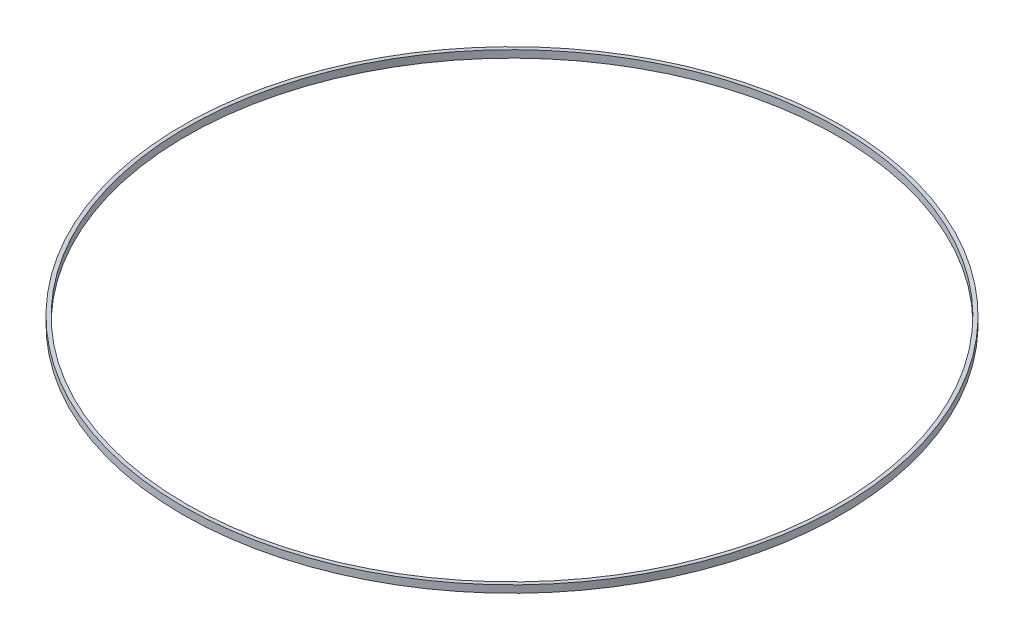
ISO-10303-21;
HEADER;
FILE_DESCRIPTION(('STEP AP214'),'2;1');
FILE_NAME('part.step','',(''),(''),'','','');
FILE_SCHEMA(('AUTOMOTIVE_DESIGN { 1 0 10303 214 1 1 1 1 }'));
ENDSEC;
DATA;
#1=APPLICATION_CONTEXT('core data for automotive mechanical design processes');
#2=APPLICATION_PROTOCOL_DEFINITION('international standard','automotive_design',2000,#1);
#3=PRODUCT_CONTEXT('',#1,'mechanical');
#4=PRODUCT('Part','Part','',(#3));
#5=PRODUCT_RELATED_PRODUCT_CATEGORY('part','',(#4));
#6=PRODUCT_DEFINITION_FORMATION('','',#4);
#7=PRODUCT_DEFINITION_CONTEXT('part definition',#1,'design');
#8=PRODUCT_DEFINITION('design','',#6,#7);
#9=PRODUCT_DEFINITION_SHAPE('','',#8);
#10=(LENGTH_UNIT() NAMED_UNIT(*) SI_UNIT(.MILLI.,.METRE.));
#11=(NAMED_UNIT(*) PLANE_ANGLE_UNIT() SI_UNIT($,.RADIAN.));
#12=(NAMED_UNIT(*) SI_UNIT($,.STERADIAN.) SOLID_ANGLE_UNIT());
#13=UNCERTAINTY_MEASURE_WITH_UNIT(LENGTH_MEASURE(1.E-05),#10,'distance_accuracy_value','');
#14=(GEOMETRIC_REPRESENTATION_CONTEXT(3) GLOBAL_UNCERTAINTY_ASSIGNED_CONTEXT((#13)) GLOBAL_UNIT_ASSIGNED_CONTEXT((#10,
#11,#12)) REPRESENTATION_CONTEXT('',''));
#15=CARTESIAN_POINT('',(0.,0.,0.));
#16=DIRECTION('',(0.,0.,1.));
#17=DIRECTION('',(1.,0.,0.));
#18=AXIS2_PLACEMENT_3D('',#15,#16,#17);
#19=CARTESIAN_POINT('',(0.,1.,0.));
#20=DIRECTION('',(0.,1.,0.));
#21=DIRECTION('',(0.,0.,1.));
#22=AXIS2_PLACEMENT_3D('',#19,#20,#21);
#23=PLANE('',#22);
#24=CARTESIAN_POINT('',(0.,1.,0.));
#25=DIRECTION('',(0.,1.,0.));
#26=DIRECTION('',(0.,0.,1.));
#27=AXIS2_PLACEMENT_3D('',#24,#25,#26);
#28=CIRCLE('',#27,45.);
#29=CARTESIAN_POINT('',(0.,1.,45.));
#30=VERTEX_POINT('',#29);
#31=EDGE_CURVE('E10',#30,#30,#28,.T.);
#32=ORIENTED_EDGE('',*,*,#31,.T.);
#33=EDGE_LOOP('',(#32));
#34=FACE_BOUND('',#33,.T.);
#35=CARTESIAN_POINT('',(0.,1.,0.));
#36=DIRECTION('',(0.,1.,0.));
#37=DIRECTION('',(0.,0.,1.));
#38=AXIS2_PLACEMENT_3D('',#35,#36,#37);
#39=CIRCLE('',#38,44.5);
#40=CARTESIAN_POINT('',(0.,1.,44.5));
#41=VERTEX_POINT('',#40);
#42=EDGE_CURVE('E46',#41,#41,#39,.T.);
#43=ORIENTED_EDGE('',*,*,#42,.F.);
#44=EDGE_LOOP('',(#43));
#45=FACE_BOUND('',#44,.T.);
#46=ADVANCED_FACE('F35',(#34,#45),#23,.T.);
#47=CARTESIAN_POINT('',(0.,0.,0.));
#48=DIRECTION('',(0.,1.,0.));
#49=DIRECTION('',(0.,0.,1.));
#50=AXIS2_PLACEMENT_3D('',#47,#48,#49);
#51=PLANE('',#50);
#52=CARTESIAN_POINT('',(0.,0.,0.));
#53=DIRECTION('',(0.,1.,0.));
#54=DIRECTION('',(0.,0.,1.));
#55=AXIS2_PLACEMENT_3D('',#52,#53,#54);
#56=CIRCLE('',#55,45.);
#57=CARTESIAN_POINT('',(0.,0.,45.));
#58=VERTEX_POINT('',#57);
#59=EDGE_CURVE('E39',#58,#58,#56,.T.);
#60=ORIENTED_EDGE('',*,*,#59,.F.);
#61=EDGE_LOOP('',(#60));
#62=FACE_BOUND('',#61,.T.);
#63=CARTESIAN_POINT('',(0.,0.,0.));
#64=DIRECTION('',(0.,1.,0.));
#65=DIRECTION('',(0.,0.,1.));
#66=AXIS2_PLACEMENT_3D('',#63,#64,#65);
#67=CIRCLE('',#66,44.5);
#68=CARTESIAN_POINT('',(0.,0.,44.5));
#69=VERTEX_POINT('',#68);
#70=EDGE_CURVE('E48',#69,#69,#67,.T.);
#71=ORIENTED_EDGE('',*,*,#70,.T.);
#72=EDGE_LOOP('',(#71));
#73=FACE_BOUND('',#72,.T.);
#74=ADVANCED_FACE('F58',(#62,#73),#51,.F.);
#75=CARTESIAN_POINT('',(0.,1.,0.));
#76=DIRECTION('',(0.,-1.,0.));
#77=DIRECTION('',(0.,0.,-1.));
#78=AXIS2_PLACEMENT_3D('',#75,#76,#77);
#79=CYLINDRICAL_SURFACE('',#78,45.);
#80=ORIENTED_EDGE('',*,*,#31,.F.);
#81=EDGE_LOOP('',(#80));
#82=FACE_BOUND('',#81,.T.);
#83=ORIENTED_EDGE('',*,*,#59,.T.);
#84=EDGE_LOOP('',(#83));
#85=FACE_BOUND('',#84,.T.);
#86=ADVANCED_FACE('F37',(#82,#85),#79,.T.);
#87=CARTESIAN_POINT('',(0.,1.,0.));
#88=DIRECTION('',(0.,-1.,0.));
#89=DIRECTION('',(0.,0.,-1.));
#90=AXIS2_PLACEMENT_3D('',#87,#88,#89);
#91=CYLINDRICAL_SURFACE('',#90,44.5);
#92=ORIENTED_EDGE('',*,*,#42,.T.);
#93=EDGE_LOOP('',(#92));
#94=FACE_BOUND('',#93,.T.);
#95=ORIENTED_EDGE('',*,*,#70,.F.);
#96=EDGE_LOOP('',(#95));
#97=FACE_BOUND('',#96,.T.);
#98=ADVANCED_FACE('F54',(#94,#97),#91,.F.);
#99=CLOSED_SHELL('',(#46,#74,#86,#98));
#100=MANIFOLD_SOLID_BREP('B2',#99);
#101=ADVANCED_BREP_SHAPE_REPRESENTATION('',(#18,#100),#14);
#102=SHAPE_DEFINITION_REPRESENTATION(#9,#101);
ENDSEC;
END-ISO-10303-21;
